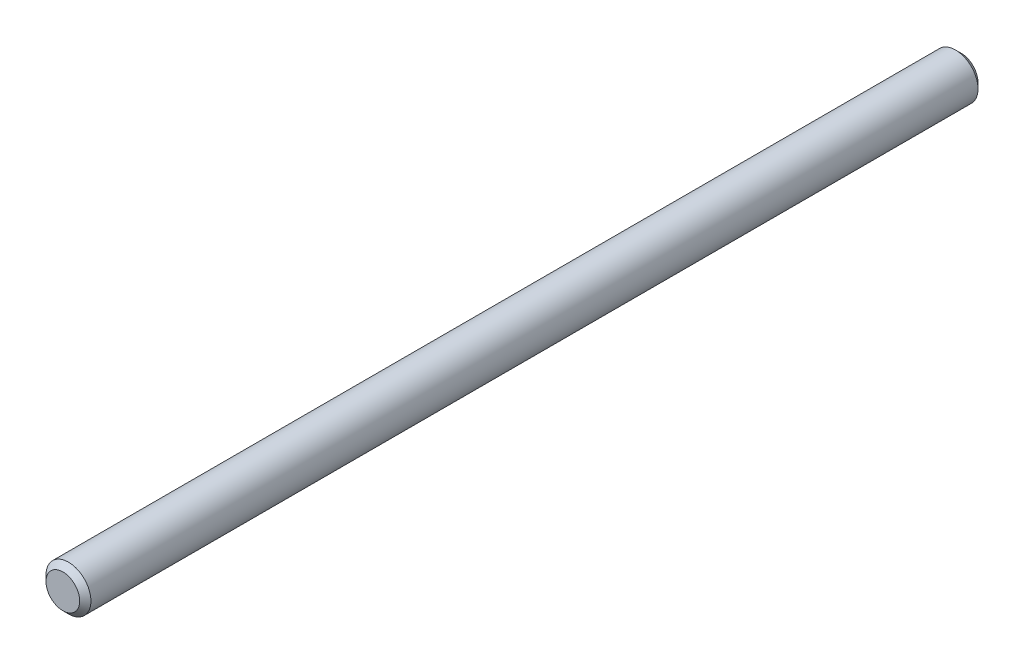
ISO-10303-21;
HEADER;
FILE_DESCRIPTION(('STEP AP214'),'2;1');
FILE_NAME('part.step','',(''),(''),'','','');
FILE_SCHEMA(('AUTOMOTIVE_DESIGN { 1 0 10303 214 1 1 1 1 }'));
ENDSEC;
DATA;
#1=APPLICATION_CONTEXT('core data for automotive mechanical design processes');
#2=APPLICATION_PROTOCOL_DEFINITION('international standard','automotive_design',2000,#1);
#3=PRODUCT_CONTEXT('',#1,'mechanical');
#4=PRODUCT('Part','Part','',(#3));
#5=PRODUCT_RELATED_PRODUCT_CATEGORY('part','',(#4));
#6=PRODUCT_DEFINITION_FORMATION('','',#4);
#7=PRODUCT_DEFINITION_CONTEXT('part definition',#1,'design');
#8=PRODUCT_DEFINITION('design','',#6,#7);
#9=PRODUCT_DEFINITION_SHAPE('','',#8);
#10=(LENGTH_UNIT() NAMED_UNIT(*) SI_UNIT(.MILLI.,.METRE.));
#11=(NAMED_UNIT(*) PLANE_ANGLE_UNIT() SI_UNIT($,.RADIAN.));
#12=(NAMED_UNIT(*) SI_UNIT($,.STERADIAN.) SOLID_ANGLE_UNIT());
#13=UNCERTAINTY_MEASURE_WITH_UNIT(LENGTH_MEASURE(1.E-05),#10,'distance_accuracy_value','');
#14=(GEOMETRIC_REPRESENTATION_CONTEXT(3) GLOBAL_UNCERTAINTY_ASSIGNED_CONTEXT((#13)) GLOBAL_UNIT_ASSIGNED_CONTEXT((#10,
#11,#12)) REPRESENTATION_CONTEXT('',''));
#15=CARTESIAN_POINT('',(0.,0.,0.));
#16=DIRECTION('',(0.,0.,1.));
#17=DIRECTION('',(1.,0.,0.));
#18=AXIS2_PLACEMENT_3D('',#15,#16,#17);
#19=CARTESIAN_POINT('',(0.,0.,160.));
#20=DIRECTION('',(0.,0.,-1.));
#21=DIRECTION('',(-1.,0.,0.));
#22=AXIS2_PLACEMENT_3D('',#19,#20,#21);
#23=CYLINDRICAL_SURFACE('',#22,4.);
#24=CARTESIAN_POINT('',(0.,0.,159.));
#25=DIRECTION('',(0.,0.,1.));
#26=DIRECTION('',(1.,0.,0.));
#27=AXIS2_PLACEMENT_3D('',#24,#25,#26);
#28=CIRCLE('',#27,4.);
#29=CARTESIAN_POINT('',(4.,0.,159.));
#30=VERTEX_POINT('',#29);
#31=EDGE_CURVE('E44',#30,#30,#28,.F.);
#32=ORIENTED_EDGE('',*,*,#31,.T.);
#33=EDGE_LOOP('',(#32));
#34=FACE_BOUND('',#33,.T.);
#35=CARTESIAN_POINT('',(0.,0.,0.999999999999973));
#36=DIRECTION('',(0.,0.,1.));
#37=DIRECTION('',(1.,0.,0.));
#38=AXIS2_PLACEMENT_3D('',#35,#36,#37);
#39=CIRCLE('',#38,4.);
#40=CARTESIAN_POINT('',(4.,0.,0.999999999999973));
#41=VERTEX_POINT('',#40);
#42=EDGE_CURVE('E48',#41,#41,#39,.T.);
#43=ORIENTED_EDGE('',*,*,#42,.T.);
#44=EDGE_LOOP('',(#43));
#45=FACE_BOUND('',#44,.T.);
#46=ADVANCED_FACE('F37',(#34,#45),#23,.T.);
#47=CARTESIAN_POINT('',(0.,0.,160.));
#48=DIRECTION('',(0.,0.,1.));
#49=DIRECTION('',(1.,0.,0.));
#50=AXIS2_PLACEMENT_3D('',#47,#48,#49);
#51=PLANE('',#50);
#52=CARTESIAN_POINT('',(0.,0.,160.));
#53=DIRECTION('',(0.,0.,1.));
#54=DIRECTION('',(1.,0.,0.));
#55=AXIS2_PLACEMENT_3D('',#52,#53,#54);
#56=CIRCLE('',#55,3.);
#57=CARTESIAN_POINT('',(3.,0.,160.));
#58=VERTEX_POINT('',#57);
#59=EDGE_CURVE('E52',#58,#58,#56,.T.);
#60=ORIENTED_EDGE('',*,*,#59,.T.);
#61=EDGE_LOOP('',(#60));
#62=FACE_BOUND('',#61,.T.);
#63=ADVANCED_FACE('F58',(#62),#51,.T.);
#64=CARTESIAN_POINT('',(0.,0.,0.));
#65=DIRECTION('',(0.,0.,1.));
#66=DIRECTION('',(1.,0.,0.));
#67=AXIS2_PLACEMENT_3D('',#64,#65,#66);
#68=PLANE('',#67);
#69=CARTESIAN_POINT('',(0.,0.,0.));
#70=DIRECTION('',(0.,0.,1.));
#71=DIRECTION('',(1.,0.,0.));
#72=AXIS2_PLACEMENT_3D('',#69,#70,#71);
#73=CIRCLE('',#72,3.);
#74=CARTESIAN_POINT('',(3.,0.,0.));
#75=VERTEX_POINT('',#74);
#76=EDGE_CURVE('E10',#75,#75,#73,.F.);
#77=ORIENTED_EDGE('',*,*,#76,.T.);
#78=EDGE_LOOP('',(#77));
#79=FACE_BOUND('',#78,.T.);
#80=ADVANCED_FACE('F62',(#79),#68,.F.);
#81=CARTESIAN_POINT('',(0.,0.,160.));
#82=DIRECTION('',(0.,0.,-1.));
#83=DIRECTION('',(-1.,0.,0.));
#84=AXIS2_PLACEMENT_3D('',#81,#82,#83);
#85=CONICAL_SURFACE('',#84,3.,0.78539816339746);
#86=ORIENTED_EDGE('',*,*,#31,.F.);
#87=EDGE_LOOP('',(#86));
#88=FACE_BOUND('',#87,.T.);
#89=ORIENTED_EDGE('',*,*,#59,.F.);
#90=EDGE_LOOP('',(#89));
#91=FACE_BOUND('',#90,.T.);
#92=ADVANCED_FACE('F60',(#88,#91),#85,.T.);
#93=CARTESIAN_POINT('',(0.,0.,0.999999999999973));
#94=DIRECTION('',(0.,0.,1.));
#95=DIRECTION('',(1.,0.,0.));
#96=AXIS2_PLACEMENT_3D('',#93,#94,#95);
#97=CONICAL_SURFACE('',#96,4.,0.78539816339746);
#98=ORIENTED_EDGE('',*,*,#76,.F.);
#99=EDGE_LOOP('',(#98));
#100=FACE_BOUND('',#99,.T.);
#101=ORIENTED_EDGE('',*,*,#42,.F.);
#102=EDGE_LOOP('',(#101));
#103=FACE_BOUND('',#102,.T.);
#104=ADVANCED_FACE('F39',(#100,#103),#97,.T.);
#105=CLOSED_SHELL('',(#46,#63,#80,#92,#104));
#106=MANIFOLD_SOLID_BREP('B2',#105);
#107=ADVANCED_BREP_SHAPE_REPRESENTATION('',(#18,#106),#14);
#108=SHAPE_DEFINITION_REPRESENTATION(#9,#107);
ENDSEC;
END-ISO-10303-21;
